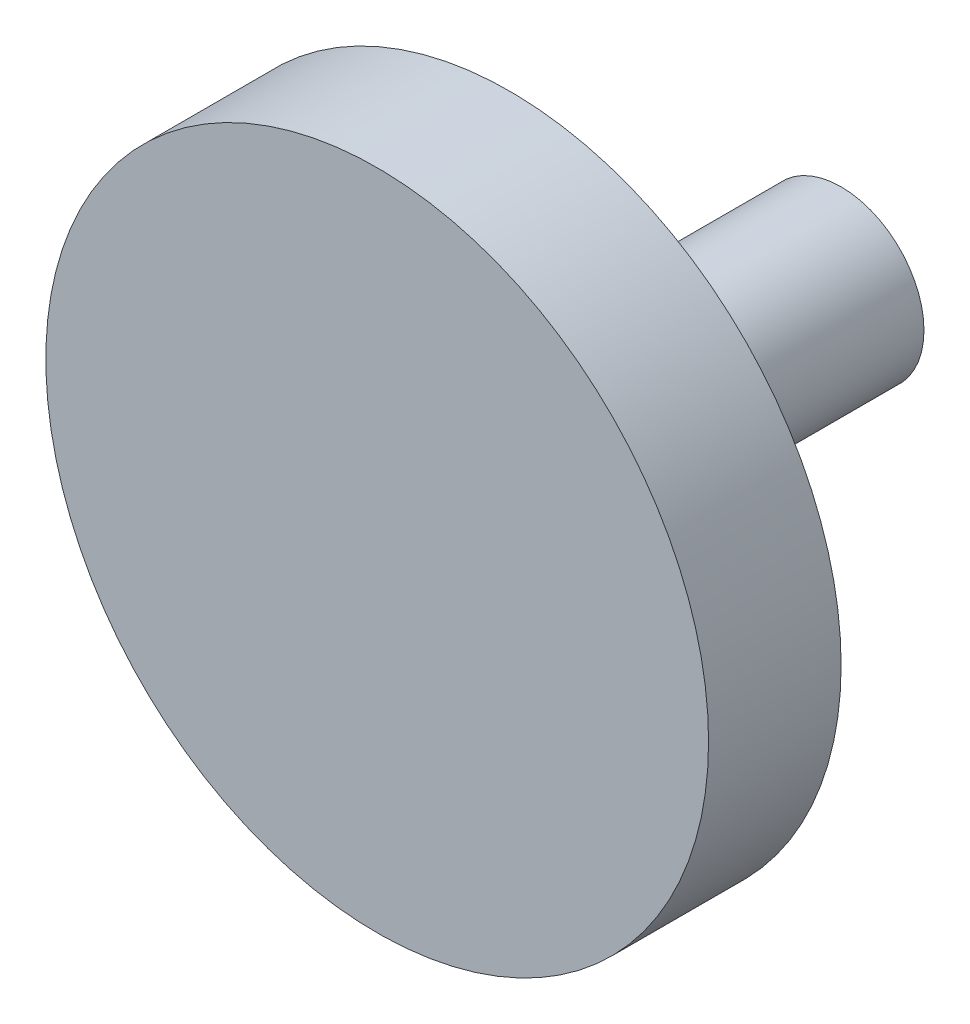
ISO-10303-21;
HEADER;
FILE_DESCRIPTION(('STEP AP214'),'2;1');
FILE_NAME('part.step','',(''),(''),'','','');
FILE_SCHEMA(('AUTOMOTIVE_DESIGN { 1 0 10303 214 1 1 1 1 }'));
ENDSEC;
DATA;
#1=APPLICATION_CONTEXT('core data for automotive mechanical design processes');
#2=APPLICATION_PROTOCOL_DEFINITION('international standard','automotive_design',2000,#1);
#3=PRODUCT_CONTEXT('',#1,'mechanical');
#4=PRODUCT('Part','Part','',(#3));
#5=PRODUCT_RELATED_PRODUCT_CATEGORY('part','',(#4));
#6=PRODUCT_DEFINITION_FORMATION('','',#4);
#7=PRODUCT_DEFINITION_CONTEXT('part definition',#1,'design');
#8=PRODUCT_DEFINITION('design','',#6,#7);
#9=PRODUCT_DEFINITION_SHAPE('','',#8);
#10=(LENGTH_UNIT() NAMED_UNIT(*) SI_UNIT(.MILLI.,.METRE.));
#11=(NAMED_UNIT(*) PLANE_ANGLE_UNIT() SI_UNIT($,.RADIAN.));
#12=(NAMED_UNIT(*) SI_UNIT($,.STERADIAN.) SOLID_ANGLE_UNIT());
#13=UNCERTAINTY_MEASURE_WITH_UNIT(LENGTH_MEASURE(1.E-05),#10,'distance_accuracy_value','');
#14=(GEOMETRIC_REPRESENTATION_CONTEXT(3) GLOBAL_UNCERTAINTY_ASSIGNED_CONTEXT((#13)) GLOBAL_UNIT_ASSIGNED_CONTEXT((#10,
#11,#12)) REPRESENTATION_CONTEXT('',''));
#15=CARTESIAN_POINT('',(0.,0.,0.));
#16=DIRECTION('',(0.,0.,1.));
#17=DIRECTION('',(1.,0.,0.));
#18=AXIS2_PLACEMENT_3D('',#15,#16,#17);
#19=CARTESIAN_POINT('',(0.,0.,14.));
#20=DIRECTION('',(0.,0.,-1.));
#21=DIRECTION('',(0.,-1.,0.));
#22=AXIS2_PLACEMENT_3D('',#19,#20,#21);
#23=PLANE('',#22);
#24=CARTESIAN_POINT('',(0.,0.,14.));
#25=DIRECTION('',(0.,0.,-1.));
#26=DIRECTION('',(1.,0.,0.));
#27=AXIS2_PLACEMENT_3D('',#24,#25,#26);
#28=CIRCLE('',#27,10.);
#29=CARTESIAN_POINT('',(10.,0.,14.));
#30=VERTEX_POINT('',#29);
#31=EDGE_CURVE('E11',#30,#30,#28,.T.);
#32=ORIENTED_EDGE('',*,*,#31,.F.);
#33=EDGE_LOOP('',(#32));
#34=FACE_BOUND('',#33,.T.);
#35=ADVANCED_FACE('F17',(#34),#23,.F.);
#36=CARTESIAN_POINT('',(0.,0.,10.));
#37=DIRECTION('',(0.,0.,-1.));
#38=DIRECTION('',(0.,-1.,0.));
#39=AXIS2_PLACEMENT_3D('',#36,#37,#38);
#40=PLANE('',#39);
#41=CARTESIAN_POINT('',(0.,0.,10.));
#42=DIRECTION('',(0.,0.,-1.));
#43=DIRECTION('',(1.,0.,0.));
#44=AXIS2_PLACEMENT_3D('',#41,#42,#43);
#45=CIRCLE('',#44,10.);
#46=CARTESIAN_POINT('',(10.,0.,10.));
#47=VERTEX_POINT('',#46);
#48=EDGE_CURVE('E26',#47,#47,#45,.T.);
#49=ORIENTED_EDGE('',*,*,#48,.T.);
#50=EDGE_LOOP('',(#49));
#51=FACE_BOUND('',#50,.T.);
#52=CARTESIAN_POINT('',(0.,0.,10.));
#53=DIRECTION('',(0.,0.,1.));
#54=DIRECTION('',(-1.,0.,0.));
#55=AXIS2_PLACEMENT_3D('',#52,#53,#54);
#56=CIRCLE('',#55,2.5);
#57=CARTESIAN_POINT('',(-2.5,0.,10.));
#58=VERTEX_POINT('',#57);
#59=EDGE_CURVE('E50',#58,#58,#56,.T.);
#60=ORIENTED_EDGE('',*,*,#59,.T.);
#61=EDGE_LOOP('',(#60));
#62=FACE_BOUND('',#61,.T.);
#63=ADVANCED_FACE('F51',(#51,#62),#40,.T.);
#64=CARTESIAN_POINT('',(0.,0.,10.));
#65=DIRECTION('',(0.,0.,1.));
#66=DIRECTION('',(1.,0.,0.));
#67=AXIS2_PLACEMENT_3D('',#64,#65,#66);
#68=CYLINDRICAL_SURFACE('',#67,10.);
#69=ORIENTED_EDGE('',*,*,#31,.T.);
#70=EDGE_LOOP('',(#69));
#71=FACE_BOUND('',#70,.T.);
#72=ORIENTED_EDGE('',*,*,#48,.F.);
#73=EDGE_LOOP('',(#72));
#74=FACE_BOUND('',#73,.T.);
#75=ADVANCED_FACE('F66',(#71,#74),#68,.T.);
#76=CARTESIAN_POINT('',(0.,0.,0.));
#77=DIRECTION('',(0.,0.,-1.));
#78=DIRECTION('',(0.,-1.,0.));
#79=AXIS2_PLACEMENT_3D('',#76,#77,#78);
#80=PLANE('',#79);
#81=CARTESIAN_POINT('',(0.,0.,0.));
#82=DIRECTION('',(0.,0.,-1.));
#83=DIRECTION('',(1.,0.,0.));
#84=AXIS2_PLACEMENT_3D('',#81,#82,#83);
#85=CIRCLE('',#84,2.5);
#86=CARTESIAN_POINT('',(2.5,0.,0.));
#87=VERTEX_POINT('',#86);
#88=EDGE_CURVE('E44',#87,#87,#85,.T.);
#89=ORIENTED_EDGE('',*,*,#88,.T.);
#90=EDGE_LOOP('',(#89));
#91=FACE_BOUND('',#90,.T.);
#92=ADVANCED_FACE('F68',(#91),#80,.T.);
#93=CARTESIAN_POINT('',(0.,0.,10.));
#94=DIRECTION('',(0.,0.,-1.));
#95=DIRECTION('',(-1.,0.,0.));
#96=AXIS2_PLACEMENT_3D('',#93,#94,#95);
#97=CYLINDRICAL_SURFACE('',#96,2.5);
#98=ORIENTED_EDGE('',*,*,#88,.F.);
#99=EDGE_LOOP('',(#98));
#100=FACE_BOUND('',#99,.T.);
#101=ORIENTED_EDGE('',*,*,#59,.F.);
#102=EDGE_LOOP('',(#101));
#103=FACE_BOUND('',#102,.T.);
#104=ADVANCED_FACE('F75',(#100,#103),#97,.T.);
#105=CLOSED_SHELL('',(#35,#63,#75,#92,#104));
#106=MANIFOLD_SOLID_BREP('B1',#105);
#107=ADVANCED_BREP_SHAPE_REPRESENTATION('',(#18,#106),#14);
#108=SHAPE_DEFINITION_REPRESENTATION(#9,#107);
ENDSEC;
END-ISO-10303-21;
